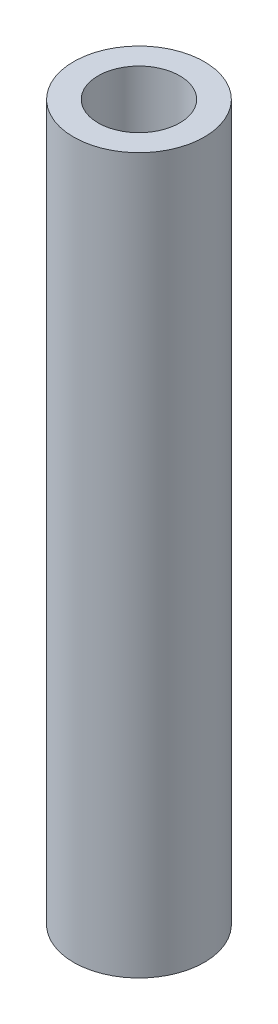
ISO-10303-21;
HEADER;
FILE_DESCRIPTION(('STEP AP214'),'2;1');
FILE_NAME('part.step','',(''),(''),'','','');
FILE_SCHEMA(('AUTOMOTIVE_DESIGN { 1 0 10303 214 1 1 1 1 }'));
ENDSEC;
DATA;
#1=APPLICATION_CONTEXT('core data for automotive mechanical design processes');
#2=APPLICATION_PROTOCOL_DEFINITION('international standard','automotive_design',2000,#1);
#3=PRODUCT_CONTEXT('',#1,'mechanical');
#4=PRODUCT('Part','Part','',(#3));
#5=PRODUCT_RELATED_PRODUCT_CATEGORY('part','',(#4));
#6=PRODUCT_DEFINITION_FORMATION('','',#4);
#7=PRODUCT_DEFINITION_CONTEXT('part definition',#1,'design');
#8=PRODUCT_DEFINITION('design','',#6,#7);
#9=PRODUCT_DEFINITION_SHAPE('','',#8);
#10=(LENGTH_UNIT() NAMED_UNIT(*) SI_UNIT(.MILLI.,.METRE.));
#11=(NAMED_UNIT(*) PLANE_ANGLE_UNIT() SI_UNIT($,.RADIAN.));
#12=(NAMED_UNIT(*) SI_UNIT($,.STERADIAN.) SOLID_ANGLE_UNIT());
#13=UNCERTAINTY_MEASURE_WITH_UNIT(LENGTH_MEASURE(1.E-05),#10,'distance_accuracy_value','');
#14=(GEOMETRIC_REPRESENTATION_CONTEXT(3) GLOBAL_UNCERTAINTY_ASSIGNED_CONTEXT((#13)) GLOBAL_UNIT_ASSIGNED_CONTEXT((#10,
#11,#12)) REPRESENTATION_CONTEXT('',''));
#15=CARTESIAN_POINT('',(0.,0.,0.));
#16=DIRECTION('',(0.,0.,1.));
#17=DIRECTION('',(1.,0.,0.));
#18=AXIS2_PLACEMENT_3D('',#15,#16,#17);
#19=CARTESIAN_POINT('',(0.,43.75,0.));
#20=DIRECTION('',(0.,1.,0.));
#21=DIRECTION('',(0.,0.,1.));
#22=AXIS2_PLACEMENT_3D('',#19,#20,#21);
#23=PLANE('',#22);
#24=CARTESIAN_POINT('',(0.,43.75,0.));
#25=DIRECTION('',(0.,1.,0.));
#26=DIRECTION('',(0.,0.,1.));
#27=AXIS2_PLACEMENT_3D('',#24,#25,#26);
#28=CIRCLE('',#27,4.);
#29=CARTESIAN_POINT('',(0.,43.75,4.));
#30=VERTEX_POINT('',#29);
#31=EDGE_CURVE('E10',#30,#30,#28,.T.);
#32=ORIENTED_EDGE('',*,*,#31,.T.);
#33=EDGE_LOOP('',(#32));
#34=FACE_BOUND('',#33,.T.);
#35=CARTESIAN_POINT('',(0.,43.75,0.));
#36=DIRECTION('',(0.,1.,0.));
#37=DIRECTION('',(0.,0.,1.));
#38=AXIS2_PLACEMENT_3D('',#35,#36,#37);
#39=CIRCLE('',#38,2.5);
#40=CARTESIAN_POINT('',(0.,43.75,2.5));
#41=VERTEX_POINT('',#40);
#42=EDGE_CURVE('E50',#41,#41,#39,.T.);
#43=ORIENTED_EDGE('',*,*,#42,.F.);
#44=EDGE_LOOP('',(#43));
#45=FACE_BOUND('',#44,.T.);
#46=ADVANCED_FACE('F37',(#34,#45),#23,.T.);
#47=CARTESIAN_POINT('',(0.,0.,0.));
#48=DIRECTION('',(0.,1.,0.));
#49=DIRECTION('',(0.,0.,1.));
#50=AXIS2_PLACEMENT_3D('',#47,#48,#49);
#51=PLANE('',#50);
#52=CARTESIAN_POINT('',(0.,0.,0.));
#53=DIRECTION('',(0.,1.,0.));
#54=DIRECTION('',(0.,0.,1.));
#55=AXIS2_PLACEMENT_3D('',#52,#53,#54);
#56=CIRCLE('',#55,4.);
#57=CARTESIAN_POINT('',(0.,0.,4.));
#58=VERTEX_POINT('',#57);
#59=EDGE_CURVE('E41',#58,#58,#56,.T.);
#60=ORIENTED_EDGE('',*,*,#59,.F.);
#61=EDGE_LOOP('',(#60));
#62=FACE_BOUND('',#61,.T.);
#63=CARTESIAN_POINT('',(0.,0.,0.));
#64=DIRECTION('',(0.,1.,0.));
#65=DIRECTION('',(0.,0.,1.));
#66=AXIS2_PLACEMENT_3D('',#63,#64,#65);
#67=CIRCLE('',#66,2.5);
#68=CARTESIAN_POINT('',(0.,0.,2.5));
#69=VERTEX_POINT('',#68);
#70=EDGE_CURVE('E52',#69,#69,#67,.T.);
#71=ORIENTED_EDGE('',*,*,#70,.T.);
#72=EDGE_LOOP('',(#71));
#73=FACE_BOUND('',#72,.T.);
#74=ADVANCED_FACE('F64',(#62,#73),#51,.F.);
#75=CARTESIAN_POINT('',(0.,43.75,0.));
#76=DIRECTION('',(0.,-1.,0.));
#77=DIRECTION('',(0.,0.,-1.));
#78=AXIS2_PLACEMENT_3D('',#75,#76,#77);
#79=CYLINDRICAL_SURFACE('',#78,4.);
#80=ORIENTED_EDGE('',*,*,#31,.F.);
#81=EDGE_LOOP('',(#80));
#82=FACE_BOUND('',#81,.T.);
#83=ORIENTED_EDGE('',*,*,#59,.T.);
#84=EDGE_LOOP('',(#83));
#85=FACE_BOUND('',#84,.T.);
#86=ADVANCED_FACE('F39',(#82,#85),#79,.T.);
#87=CARTESIAN_POINT('',(0.,43.75,0.));
#88=DIRECTION('',(0.,-1.,0.));
#89=DIRECTION('',(0.,0.,-1.));
#90=AXIS2_PLACEMENT_3D('',#87,#88,#89);
#91=CYLINDRICAL_SURFACE('',#90,2.5);
#92=ORIENTED_EDGE('',*,*,#42,.T.);
#93=EDGE_LOOP('',(#92));
#94=FACE_BOUND('',#93,.T.);
#95=ORIENTED_EDGE('',*,*,#70,.F.);
#96=EDGE_LOOP('',(#95));
#97=FACE_BOUND('',#96,.T.);
#98=ADVANCED_FACE('F60',(#94,#97),#91,.F.);
#99=CLOSED_SHELL('',(#46,#74,#86,#98));
#100=MANIFOLD_SOLID_BREP('B2',#99);
#101=ADVANCED_BREP_SHAPE_REPRESENTATION('',(#18,#100),#14);
#102=SHAPE_DEFINITION_REPRESENTATION(#9,#101);
ENDSEC;
END-ISO-10303-21;
